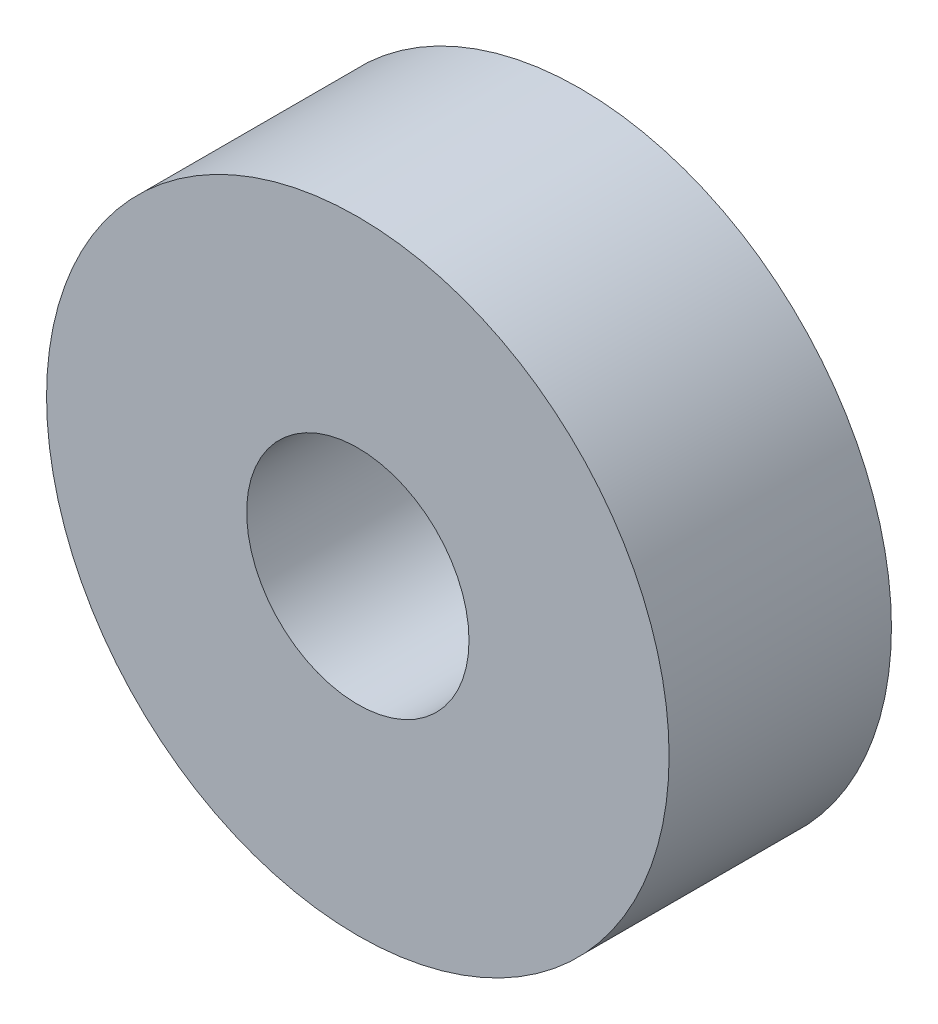
ISO-10303-21;
HEADER;
FILE_DESCRIPTION(('STEP AP214'),'2;1');
FILE_NAME('part.step','',(''),(''),'','','');
FILE_SCHEMA(('AUTOMOTIVE_DESIGN { 1 0 10303 214 1 1 1 1 }'));
ENDSEC;
DATA;
#1=APPLICATION_CONTEXT('core data for automotive mechanical design processes');
#2=APPLICATION_PROTOCOL_DEFINITION('international standard','automotive_design',2000,#1);
#3=PRODUCT_CONTEXT('',#1,'mechanical');
#4=PRODUCT('Part','Part','',(#3));
#5=PRODUCT_RELATED_PRODUCT_CATEGORY('part','',(#4));
#6=PRODUCT_DEFINITION_FORMATION('','',#4);
#7=PRODUCT_DEFINITION_CONTEXT('part definition',#1,'design');
#8=PRODUCT_DEFINITION('design','',#6,#7);
#9=PRODUCT_DEFINITION_SHAPE('','',#8);
#10=(LENGTH_UNIT() NAMED_UNIT(*) SI_UNIT(.MILLI.,.METRE.));
#11=(NAMED_UNIT(*) PLANE_ANGLE_UNIT() SI_UNIT($,.RADIAN.));
#12=(NAMED_UNIT(*) SI_UNIT($,.STERADIAN.) SOLID_ANGLE_UNIT());
#13=UNCERTAINTY_MEASURE_WITH_UNIT(LENGTH_MEASURE(1.E-05),#10,'distance_accuracy_value','');
#14=(GEOMETRIC_REPRESENTATION_CONTEXT(3) GLOBAL_UNCERTAINTY_ASSIGNED_CONTEXT((#13)) GLOBAL_UNIT_ASSIGNED_CONTEXT((#10,
#11,#12)) REPRESENTATION_CONTEXT('',''));
#15=CARTESIAN_POINT('',(0.,0.,0.));
#16=DIRECTION('',(0.,0.,1.));
#17=DIRECTION('',(1.,0.,0.));
#18=AXIS2_PLACEMENT_3D('',#15,#16,#17);
#19=CARTESIAN_POINT('',(0.,0.,5.));
#20=DIRECTION('',(0.,0.,1.));
#21=DIRECTION('',(1.,0.,0.));
#22=AXIS2_PLACEMENT_3D('',#19,#20,#21);
#23=PLANE('',#22);
#24=CARTESIAN_POINT('',(0.,0.,5.));
#25=DIRECTION('',(0.,0.,1.));
#26=DIRECTION('',(1.,0.,0.));
#27=AXIS2_PLACEMENT_3D('',#24,#25,#26);
#28=CIRCLE('',#27,7.);
#29=CARTESIAN_POINT('',(7.,0.,5.));
#30=VERTEX_POINT('',#29);
#31=EDGE_CURVE('E10',#30,#30,#28,.T.);
#32=ORIENTED_EDGE('',*,*,#31,.T.);
#33=EDGE_LOOP('',(#32));
#34=FACE_BOUND('',#33,.T.);
#35=CARTESIAN_POINT('',(0.,0.,5.));
#36=DIRECTION('',(0.,0.,1.));
#37=DIRECTION('',(1.,0.,0.));
#38=AXIS2_PLACEMENT_3D('',#35,#36,#37);
#39=CIRCLE('',#38,2.5);
#40=CARTESIAN_POINT('',(2.5,0.,5.));
#41=VERTEX_POINT('',#40);
#42=EDGE_CURVE('E48',#41,#41,#39,.T.);
#43=ORIENTED_EDGE('',*,*,#42,.F.);
#44=EDGE_LOOP('',(#43));
#45=FACE_BOUND('',#44,.T.);
#46=ADVANCED_FACE('F37',(#34,#45),#23,.T.);
#47=CARTESIAN_POINT('',(0.,0.,0.));
#48=DIRECTION('',(0.,0.,1.));
#49=DIRECTION('',(1.,0.,0.));
#50=AXIS2_PLACEMENT_3D('',#47,#48,#49);
#51=PLANE('',#50);
#52=CARTESIAN_POINT('',(0.,0.,0.));
#53=DIRECTION('',(0.,0.,1.));
#54=DIRECTION('',(1.,0.,0.));
#55=AXIS2_PLACEMENT_3D('',#52,#53,#54);
#56=CIRCLE('',#55,7.);
#57=CARTESIAN_POINT('',(7.,0.,0.));
#58=VERTEX_POINT('',#57);
#59=EDGE_CURVE('E41',#58,#58,#56,.T.);
#60=ORIENTED_EDGE('',*,*,#59,.F.);
#61=EDGE_LOOP('',(#60));
#62=FACE_BOUND('',#61,.T.);
#63=CARTESIAN_POINT('',(0.,0.,0.));
#64=DIRECTION('',(0.,0.,1.));
#65=DIRECTION('',(1.,0.,0.));
#66=AXIS2_PLACEMENT_3D('',#63,#64,#65);
#67=CIRCLE('',#66,2.5);
#68=CARTESIAN_POINT('',(2.5,0.,0.));
#69=VERTEX_POINT('',#68);
#70=EDGE_CURVE('E50',#69,#69,#67,.T.);
#71=ORIENTED_EDGE('',*,*,#70,.T.);
#72=EDGE_LOOP('',(#71));
#73=FACE_BOUND('',#72,.T.);
#74=ADVANCED_FACE('F60',(#62,#73),#51,.F.);
#75=CARTESIAN_POINT('',(0.,0.,5.));
#76=DIRECTION('',(0.,0.,-1.));
#77=DIRECTION('',(-1.,0.,0.));
#78=AXIS2_PLACEMENT_3D('',#75,#76,#77);
#79=CYLINDRICAL_SURFACE('',#78,7.);
#80=ORIENTED_EDGE('',*,*,#31,.F.);
#81=EDGE_LOOP('',(#80));
#82=FACE_BOUND('',#81,.T.);
#83=ORIENTED_EDGE('',*,*,#59,.T.);
#84=EDGE_LOOP('',(#83));
#85=FACE_BOUND('',#84,.T.);
#86=ADVANCED_FACE('F39',(#82,#85),#79,.T.);
#87=CARTESIAN_POINT('',(0.,0.,5.));
#88=DIRECTION('',(0.,0.,-1.));
#89=DIRECTION('',(-1.,0.,0.));
#90=AXIS2_PLACEMENT_3D('',#87,#88,#89);
#91=CYLINDRICAL_SURFACE('',#90,2.5);
#92=ORIENTED_EDGE('',*,*,#42,.T.);
#93=EDGE_LOOP('',(#92));
#94=FACE_BOUND('',#93,.T.);
#95=ORIENTED_EDGE('',*,*,#70,.F.);
#96=EDGE_LOOP('',(#95));
#97=FACE_BOUND('',#96,.T.);
#98=ADVANCED_FACE('F56',(#94,#97),#91,.F.);
#99=CLOSED_SHELL('',(#46,#74,#86,#98));
#100=MANIFOLD_SOLID_BREP('B2',#99);
#101=ADVANCED_BREP_SHAPE_REPRESENTATION('',(#18,#100),#14);
#102=SHAPE_DEFINITION_REPRESENTATION(#9,#101);
ENDSEC;
END-ISO-10303-21;
